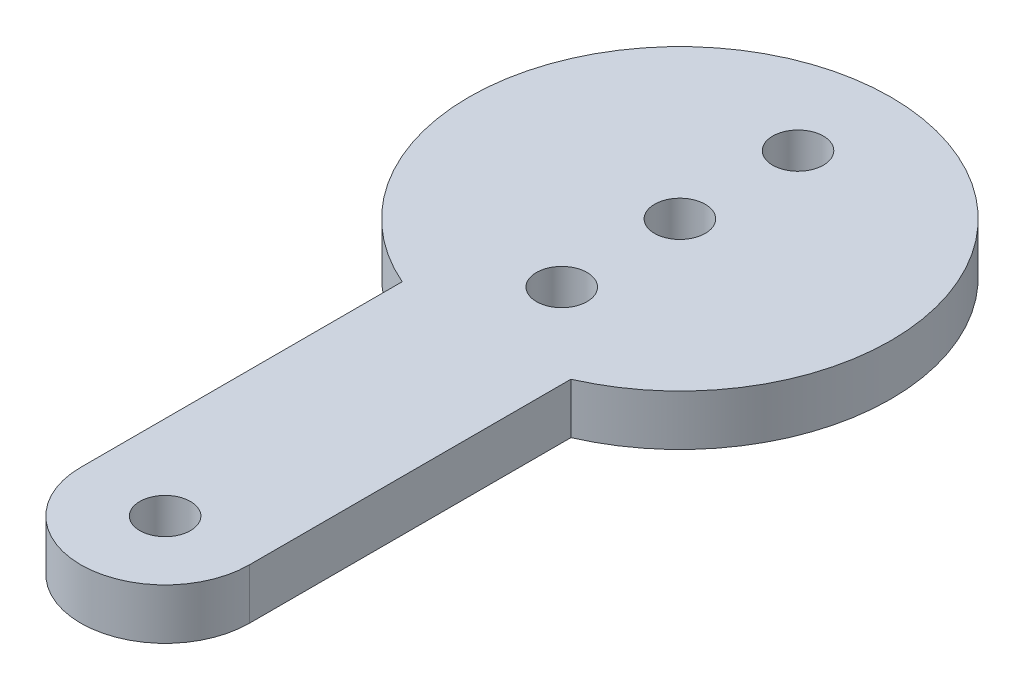
ISO-10303-21;
HEADER;
FILE_DESCRIPTION(('STEP AP214'),'2;1');
FILE_NAME('part.step','',(''),(''),'','','');
FILE_SCHEMA(('AUTOMOTIVE_DESIGN { 1 0 10303 214 1 1 1 1 }'));
ENDSEC;
DATA;
#1=APPLICATION_CONTEXT('core data for automotive mechanical design processes');
#2=APPLICATION_PROTOCOL_DEFINITION('international standard','automotive_design',2000,#1);
#3=PRODUCT_CONTEXT('',#1,'mechanical');
#4=PRODUCT('Part','Part','',(#3));
#5=PRODUCT_RELATED_PRODUCT_CATEGORY('part','',(#4));
#6=PRODUCT_DEFINITION_FORMATION('','',#4);
#7=PRODUCT_DEFINITION_CONTEXT('part definition',#1,'design');
#8=PRODUCT_DEFINITION('design','',#6,#7);
#9=PRODUCT_DEFINITION_SHAPE('','',#8);
#10=(LENGTH_UNIT() NAMED_UNIT(*) SI_UNIT(.MILLI.,.METRE.));
#11=(NAMED_UNIT(*) PLANE_ANGLE_UNIT() SI_UNIT($,.RADIAN.));
#12=(NAMED_UNIT(*) SI_UNIT($,.STERADIAN.) SOLID_ANGLE_UNIT());
#13=UNCERTAINTY_MEASURE_WITH_UNIT(LENGTH_MEASURE(1.E-05),#10,'distance_accuracy_value','');
#14=(GEOMETRIC_REPRESENTATION_CONTEXT(3) GLOBAL_UNCERTAINTY_ASSIGNED_CONTEXT((#13)) GLOBAL_UNIT_ASSIGNED_CONTEXT((#10,
#11,#12)) REPRESENTATION_CONTEXT('',''));
#15=CARTESIAN_POINT('',(0.,0.,0.));
#16=DIRECTION('',(0.,0.,1.));
#17=DIRECTION('',(1.,0.,0.));
#18=AXIS2_PLACEMENT_3D('',#15,#16,#17);
#19=CARTESIAN_POINT('',(-5.,3.,0.));
#20=DIRECTION('',(1.,0.,0.));
#21=DIRECTION('',(0.,0.,-1.));
#22=AXIS2_PLACEMENT_3D('',#19,#20,#21);
#23=PLANE('',#22);
#24=DIRECTION('',(0.,0.,1.));
#25=VECTOR('',#24,1.);
#26=CARTESIAN_POINT('',(-5.,0.,0.));
#27=LINE('',#26,#25);
#28=CARTESIAN_POINT('',(-5.,0.,11.4564392373896));
#29=VERTEX_POINT('',#28);
#30=CARTESIAN_POINT('',(-5.,0.,30.5));
#31=VERTEX_POINT('',#30);
#32=EDGE_CURVE('E110',#29,#31,#27,.T.);
#33=ORIENTED_EDGE('',*,*,#32,.T.);
#34=DIRECTION('',(0.,-1.,0.));
#35=VECTOR('',#34,1.);
#36=CARTESIAN_POINT('',(-5.,3.,30.5));
#37=LINE('',#36,#35);
#38=CARTESIAN_POINT('',(-5.,3.,30.5));
#39=VERTEX_POINT('',#38);
#40=EDGE_CURVE('E11',#39,#31,#37,.T.);
#41=ORIENTED_EDGE('',*,*,#40,.F.);
#42=DIRECTION('',(0.,0.,1.));
#43=VECTOR('',#42,1.);
#44=CARTESIAN_POINT('',(-5.,3.,0.));
#45=LINE('',#44,#43);
#46=CARTESIAN_POINT('',(-5.,3.,11.4564392373896));
#47=VERTEX_POINT('',#46);
#48=EDGE_CURVE('E84',#47,#39,#45,.T.);
#49=ORIENTED_EDGE('',*,*,#48,.F.);
#50=DIRECTION('',(0.,-1.,0.));
#51=VECTOR('',#50,1.);
#52=CARTESIAN_POINT('',(-5.,3.,11.4564392373896));
#53=LINE('',#52,#51);
#54=EDGE_CURVE('E51',#47,#29,#53,.T.);
#55=ORIENTED_EDGE('',*,*,#54,.T.);
#56=EDGE_LOOP('',(#33,#41,#49,#55));
#57=FACE_BOUND('',#56,.T.);
#58=ADVANCED_FACE('F34',(#57),#23,.F.);
#59=CARTESIAN_POINT('',(0.,3.,30.5));
#60=DIRECTION('',(0.,-1.,0.));
#61=DIRECTION('',(0.,0.,-1.));
#62=AXIS2_PLACEMENT_3D('',#59,#60,#61);
#63=CYLINDRICAL_SURFACE('',#62,5.);
#64=CARTESIAN_POINT('',(0.,0.,30.5));
#65=DIRECTION('',(0.,1.,0.));
#66=DIRECTION('',(0.,0.,1.));
#67=AXIS2_PLACEMENT_3D('',#64,#65,#66);
#68=CIRCLE('',#67,5.);
#69=CARTESIAN_POINT('',(5.,0.,30.5));
#70=VERTEX_POINT('',#69);
#71=EDGE_CURVE('E89',#31,#70,#68,.T.);
#72=ORIENTED_EDGE('',*,*,#71,.T.);
#73=DIRECTION('',(0.,-1.,0.));
#74=VECTOR('',#73,1.);
#75=CARTESIAN_POINT('',(5.,3.,30.5));
#76=LINE('',#75,#74);
#77=CARTESIAN_POINT('',(5.,3.,30.5));
#78=VERTEX_POINT('',#77);
#79=EDGE_CURVE('E43',#78,#70,#76,.T.);
#80=ORIENTED_EDGE('',*,*,#79,.F.);
#81=CARTESIAN_POINT('',(0.,3.,30.5));
#82=DIRECTION('',(0.,1.,0.));
#83=DIRECTION('',(0.,0.,1.));
#84=AXIS2_PLACEMENT_3D('',#81,#82,#83);
#85=CIRCLE('',#84,5.);
#86=EDGE_CURVE('E77',#39,#78,#85,.T.);
#87=ORIENTED_EDGE('',*,*,#86,.F.);
#88=ORIENTED_EDGE('',*,*,#40,.T.);
#89=EDGE_LOOP('',(#72,#80,#87,#88));
#90=FACE_BOUND('',#89,.T.);
#91=ADVANCED_FACE('F88',(#90),#63,.T.);
#92=CARTESIAN_POINT('',(5.,3.,0.));
#93=DIRECTION('',(-1.,0.,0.));
#94=DIRECTION('',(0.,0.,1.));
#95=AXIS2_PLACEMENT_3D('',#92,#93,#94);
#96=PLANE('',#95);
#97=DIRECTION('',(0.,0.,-1.));
#98=VECTOR('',#97,1.);
#99=CARTESIAN_POINT('',(5.,0.,0.));
#100=LINE('',#99,#98);
#101=CARTESIAN_POINT('',(5.,0.,11.4564392373896));
#102=VERTEX_POINT('',#101);
#103=EDGE_CURVE('E113',#70,#102,#100,.T.);
#104=ORIENTED_EDGE('',*,*,#103,.T.);
#105=DIRECTION('',(0.,-1.,0.));
#106=VECTOR('',#105,1.);
#107=CARTESIAN_POINT('',(5.,3.,11.4564392373896));
#108=LINE('',#107,#106);
#109=CARTESIAN_POINT('',(5.,3.,11.4564392373896));
#110=VERTEX_POINT('',#109);
#111=EDGE_CURVE('E66',#110,#102,#108,.T.);
#112=ORIENTED_EDGE('',*,*,#111,.F.);
#113=DIRECTION('',(0.,0.,-1.));
#114=VECTOR('',#113,1.);
#115=CARTESIAN_POINT('',(5.,3.,0.));
#116=LINE('',#115,#114);
#117=EDGE_CURVE('E83',#78,#110,#116,.T.);
#118=ORIENTED_EDGE('',*,*,#117,.F.);
#119=ORIENTED_EDGE('',*,*,#79,.T.);
#120=EDGE_LOOP('',(#104,#112,#118,#119));
#121=FACE_BOUND('',#120,.T.);
#122=ADVANCED_FACE('F92',(#121),#96,.F.);
#123=CARTESIAN_POINT('',(0.,3.,0.));
#124=DIRECTION('',(0.,-1.,0.));
#125=DIRECTION('',(0.,0.,-1.));
#126=AXIS2_PLACEMENT_3D('',#123,#124,#125);
#127=CYLINDRICAL_SURFACE('',#126,1.5);
#128=CARTESIAN_POINT('',(0.,3.,0.));
#129=DIRECTION('',(0.,1.,0.));
#130=DIRECTION('',(0.,0.,1.));
#131=AXIS2_PLACEMENT_3D('',#128,#129,#130);
#132=CIRCLE('',#131,1.5);
#133=CARTESIAN_POINT('',(0.,3.,1.5));
#134=VERTEX_POINT('',#133);
#135=EDGE_CURVE('E132',#134,#134,#132,.T.);
#136=ORIENTED_EDGE('',*,*,#135,.T.);
#137=EDGE_LOOP('',(#136));
#138=FACE_BOUND('',#137,.T.);
#139=CARTESIAN_POINT('',(0.,0.,0.));
#140=DIRECTION('',(0.,1.,0.));
#141=DIRECTION('',(0.,0.,1.));
#142=AXIS2_PLACEMENT_3D('',#139,#140,#141);
#143=CIRCLE('',#142,1.5);
#144=CARTESIAN_POINT('',(0.,0.,1.5));
#145=VERTEX_POINT('',#144);
#146=EDGE_CURVE('E107',#145,#145,#143,.T.);
#147=ORIENTED_EDGE('',*,*,#146,.F.);
#148=EDGE_LOOP('',(#147));
#149=FACE_BOUND('',#148,.T.);
#150=ADVANCED_FACE('F136',(#138,#149),#127,.F.);
#151=CARTESIAN_POINT('',(0.,3.,-7.));
#152=DIRECTION('',(0.,-1.,0.));
#153=DIRECTION('',(0.,0.,-1.));
#154=AXIS2_PLACEMENT_3D('',#151,#152,#153);
#155=CYLINDRICAL_SURFACE('',#154,1.5);
#156=CARTESIAN_POINT('',(0.,3.,-7.));
#157=DIRECTION('',(0.,1.,0.));
#158=DIRECTION('',(0.,0.,1.));
#159=AXIS2_PLACEMENT_3D('',#156,#157,#158);
#160=CIRCLE('',#159,1.5);
#161=CARTESIAN_POINT('',(0.,3.,-5.5));
#162=VERTEX_POINT('',#161);
#163=EDGE_CURVE('E127',#162,#162,#160,.T.);
#164=ORIENTED_EDGE('',*,*,#163,.T.);
#165=EDGE_LOOP('',(#164));
#166=FACE_BOUND('',#165,.T.);
#167=CARTESIAN_POINT('',(0.,0.,-7.));
#168=DIRECTION('',(0.,1.,0.));
#169=DIRECTION('',(0.,0.,1.));
#170=AXIS2_PLACEMENT_3D('',#167,#168,#169);
#171=CIRCLE('',#170,1.5);
#172=CARTESIAN_POINT('',(0.,0.,-5.5));
#173=VERTEX_POINT('',#172);
#174=EDGE_CURVE('E104',#173,#173,#171,.T.);
#175=ORIENTED_EDGE('',*,*,#174,.F.);
#176=EDGE_LOOP('',(#175));
#177=FACE_BOUND('',#176,.T.);
#178=ADVANCED_FACE('F162',(#166,#177),#155,.F.);
#179=CARTESIAN_POINT('',(0.,3.,7.));
#180=DIRECTION('',(0.,-1.,0.));
#181=DIRECTION('',(0.,0.,-1.));
#182=AXIS2_PLACEMENT_3D('',#179,#180,#181);
#183=CYLINDRICAL_SURFACE('',#182,1.5);
#184=CARTESIAN_POINT('',(0.,3.,7.));
#185=DIRECTION('',(0.,1.,0.));
#186=DIRECTION('',(0.,0.,1.));
#187=AXIS2_PLACEMENT_3D('',#184,#185,#186);
#188=CIRCLE('',#187,1.5);
#189=CARTESIAN_POINT('',(0.,3.,8.5));
#190=VERTEX_POINT('',#189);
#191=EDGE_CURVE('E122',#190,#190,#188,.T.);
#192=ORIENTED_EDGE('',*,*,#191,.T.);
#193=EDGE_LOOP('',(#192));
#194=FACE_BOUND('',#193,.T.);
#195=CARTESIAN_POINT('',(0.,0.,7.));
#196=DIRECTION('',(0.,1.,0.));
#197=DIRECTION('',(0.,0.,1.));
#198=AXIS2_PLACEMENT_3D('',#195,#196,#197);
#199=CIRCLE('',#198,1.5);
#200=CARTESIAN_POINT('',(0.,0.,8.5));
#201=VERTEX_POINT('',#200);
#202=EDGE_CURVE('E101',#201,#201,#199,.T.);
#203=ORIENTED_EDGE('',*,*,#202,.F.);
#204=EDGE_LOOP('',(#203));
#205=FACE_BOUND('',#204,.T.);
#206=ADVANCED_FACE('F164',(#194,#205),#183,.F.);
#207=CARTESIAN_POINT('',(0.,3.,30.5));
#208=DIRECTION('',(0.,-1.,0.));
#209=DIRECTION('',(0.,0.,-1.));
#210=AXIS2_PLACEMENT_3D('',#207,#208,#209);
#211=CYLINDRICAL_SURFACE('',#210,1.5);
#212=CARTESIAN_POINT('',(0.,3.,30.5));
#213=DIRECTION('',(0.,1.,0.));
#214=DIRECTION('',(0.,0.,1.));
#215=AXIS2_PLACEMENT_3D('',#212,#213,#214);
#216=CIRCLE('',#215,1.5);
#217=CARTESIAN_POINT('',(0.,3.,32.));
#218=VERTEX_POINT('',#217);
#219=EDGE_CURVE('E118',#218,#218,#216,.T.);
#220=ORIENTED_EDGE('',*,*,#219,.T.);
#221=EDGE_LOOP('',(#220));
#222=FACE_BOUND('',#221,.T.);
#223=CARTESIAN_POINT('',(0.,0.,30.5));
#224=DIRECTION('',(0.,1.,0.));
#225=DIRECTION('',(0.,0.,1.));
#226=AXIS2_PLACEMENT_3D('',#223,#224,#225);
#227=CIRCLE('',#226,1.5);
#228=CARTESIAN_POINT('',(0.,0.,32.));
#229=VERTEX_POINT('',#228);
#230=EDGE_CURVE('E98',#229,#229,#227,.T.);
#231=ORIENTED_EDGE('',*,*,#230,.F.);
#232=EDGE_LOOP('',(#231));
#233=FACE_BOUND('',#232,.T.);
#234=ADVANCED_FACE('F36',(#222,#233),#211,.F.);
#235=CARTESIAN_POINT('',(0.,3.,0.));
#236=DIRECTION('',(0.,-1.,0.));
#237=DIRECTION('',(0.,0.,-1.));
#238=AXIS2_PLACEMENT_3D('',#235,#236,#237);
#239=CYLINDRICAL_SURFACE('',#238,12.5);
#240=CARTESIAN_POINT('',(0.,0.,0.));
#241=DIRECTION('',(0.,1.,0.));
#242=DIRECTION('',(0.,0.,1.));
#243=AXIS2_PLACEMENT_3D('',#240,#241,#242);
#244=CIRCLE('',#243,12.5);
#245=EDGE_CURVE('E115',#29,#102,#244,.F.);
#246=ORIENTED_EDGE('',*,*,#245,.F.);
#247=ORIENTED_EDGE('',*,*,#54,.F.);
#248=CARTESIAN_POINT('',(0.,3.,0.));
#249=DIRECTION('',(0.,1.,0.));
#250=DIRECTION('',(0.,0.,1.));
#251=AXIS2_PLACEMENT_3D('',#248,#249,#250);
#252=CIRCLE('',#251,12.5);
#253=EDGE_CURVE('E93',#47,#110,#252,.F.);
#254=ORIENTED_EDGE('',*,*,#253,.T.);
#255=ORIENTED_EDGE('',*,*,#111,.T.);
#256=EDGE_LOOP('',(#246,#247,#254,#255));
#257=FACE_BOUND('',#256,.T.);
#258=ADVANCED_FACE('F141',(#257),#239,.T.);
#259=CARTESIAN_POINT('',(0.,3.,0.));
#260=DIRECTION('',(0.,1.,0.));
#261=DIRECTION('',(0.,0.,1.));
#262=AXIS2_PLACEMENT_3D('',#259,#260,#261);
#263=PLANE('',#262);
#264=ORIENTED_EDGE('',*,*,#219,.F.);
#265=EDGE_LOOP('',(#264));
#266=FACE_BOUND('',#265,.T.);
#267=ORIENTED_EDGE('',*,*,#191,.F.);
#268=EDGE_LOOP('',(#267));
#269=FACE_BOUND('',#268,.T.);
#270=ORIENTED_EDGE('',*,*,#163,.F.);
#271=EDGE_LOOP('',(#270));
#272=FACE_BOUND('',#271,.T.);
#273=ORIENTED_EDGE('',*,*,#135,.F.);
#274=EDGE_LOOP('',(#273));
#275=FACE_BOUND('',#274,.T.);
#276=ORIENTED_EDGE('',*,*,#48,.T.);
#277=ORIENTED_EDGE('',*,*,#86,.T.);
#278=ORIENTED_EDGE('',*,*,#117,.T.);
#279=ORIENTED_EDGE('',*,*,#253,.F.);
#280=EDGE_LOOP('',(#276,#277,#278,#279));
#281=FACE_BOUND('',#280,.T.);
#282=ADVANCED_FACE('F80',(#266,#269,#272,#275,#281),#263,.T.);
#283=CARTESIAN_POINT('',(0.,0.,0.));
#284=DIRECTION('',(0.,1.,0.));
#285=DIRECTION('',(0.,0.,1.));
#286=AXIS2_PLACEMENT_3D('',#283,#284,#285);
#287=PLANE('',#286);
#288=ORIENTED_EDGE('',*,*,#230,.T.);
#289=EDGE_LOOP('',(#288));
#290=FACE_BOUND('',#289,.T.);
#291=ORIENTED_EDGE('',*,*,#202,.T.);
#292=EDGE_LOOP('',(#291));
#293=FACE_BOUND('',#292,.T.);
#294=ORIENTED_EDGE('',*,*,#174,.T.);
#295=EDGE_LOOP('',(#294));
#296=FACE_BOUND('',#295,.T.);
#297=ORIENTED_EDGE('',*,*,#146,.T.);
#298=EDGE_LOOP('',(#297));
#299=FACE_BOUND('',#298,.T.);
#300=ORIENTED_EDGE('',*,*,#32,.F.);
#301=ORIENTED_EDGE('',*,*,#245,.T.);
#302=ORIENTED_EDGE('',*,*,#103,.F.);
#303=ORIENTED_EDGE('',*,*,#71,.F.);
#304=EDGE_LOOP('',(#300,#301,#302,#303));
#305=FACE_BOUND('',#304,.T.);
#306=ADVANCED_FACE('F140',(#290,#293,#296,#299,#305),#287,.F.);
#307=CLOSED_SHELL('',(#58,#91,#122,#150,#178,#206,#234,#258,#282,#306));
#308=MANIFOLD_SOLID_BREP('B2',#307);
#309=ADVANCED_BREP_SHAPE_REPRESENTATION('',(#18,#308),#14);
#310=SHAPE_DEFINITION_REPRESENTATION(#9,#309);
ENDSEC;
END-ISO-10303-21;
